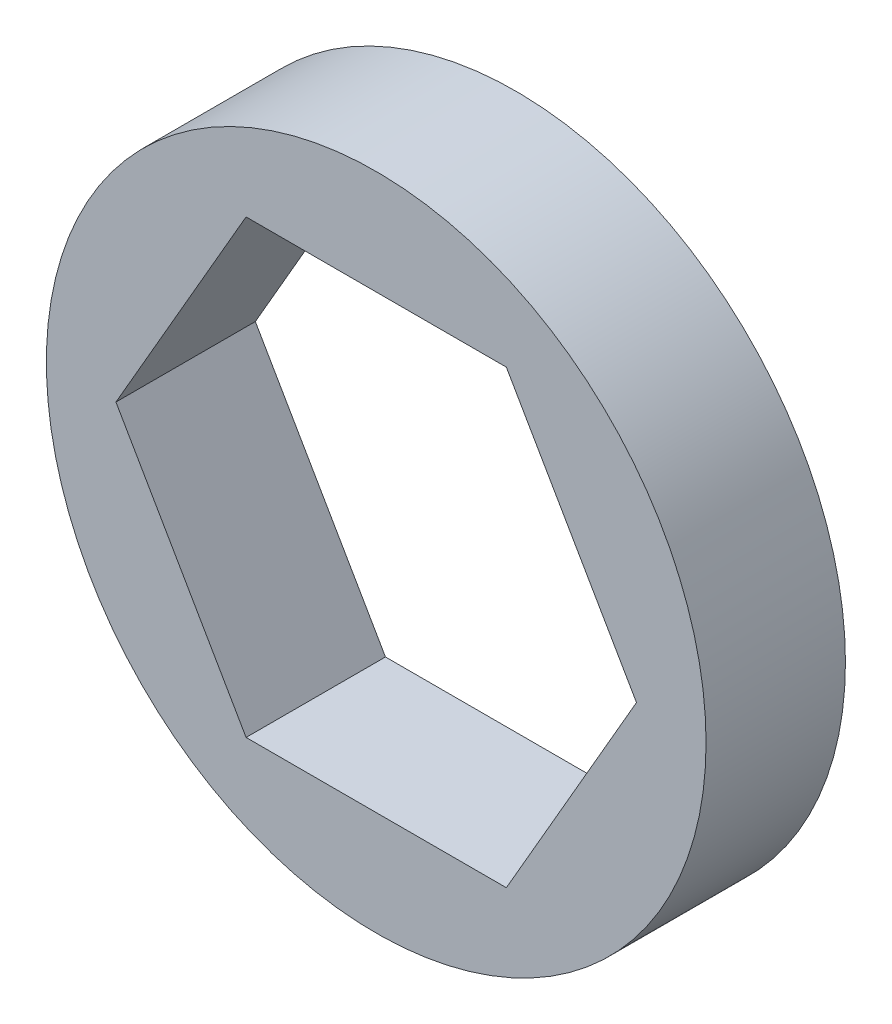
ISO-10303-21;
HEADER;
FILE_DESCRIPTION(('STEP AP214'),'2;1');
FILE_NAME('part.step','',(''),(''),'','','');
FILE_SCHEMA(('AUTOMOTIVE_DESIGN { 1 0 10303 214 1 1 1 1 }'));
ENDSEC;
DATA;
#1=APPLICATION_CONTEXT('core data for automotive mechanical design processes');
#2=APPLICATION_PROTOCOL_DEFINITION('international standard','automotive_design',2000,#1);
#3=PRODUCT_CONTEXT('',#1,'mechanical');
#4=PRODUCT('Part','Part','',(#3));
#5=PRODUCT_RELATED_PRODUCT_CATEGORY('part','',(#4));
#6=PRODUCT_DEFINITION_FORMATION('','',#4);
#7=PRODUCT_DEFINITION_CONTEXT('part definition',#1,'design');
#8=PRODUCT_DEFINITION('design','',#6,#7);
#9=PRODUCT_DEFINITION_SHAPE('','',#8);
#10=(LENGTH_UNIT() NAMED_UNIT(*) SI_UNIT(.MILLI.,.METRE.));
#11=(NAMED_UNIT(*) PLANE_ANGLE_UNIT() SI_UNIT($,.RADIAN.));
#12=(NAMED_UNIT(*) SI_UNIT($,.STERADIAN.) SOLID_ANGLE_UNIT());
#13=UNCERTAINTY_MEASURE_WITH_UNIT(LENGTH_MEASURE(1.E-05),#10,'distance_accuracy_value','');
#14=(GEOMETRIC_REPRESENTATION_CONTEXT(3) GLOBAL_UNCERTAINTY_ASSIGNED_CONTEXT((#13)) GLOBAL_UNIT_ASSIGNED_CONTEXT((#10,
#11,#12)) REPRESENTATION_CONTEXT('',''));
#15=CARTESIAN_POINT('',(0.,0.,0.));
#16=DIRECTION('',(0.,0.,1.));
#17=DIRECTION('',(1.,0.,0.));
#18=AXIS2_PLACEMENT_3D('',#15,#16,#17);
#19=CARTESIAN_POINT('',(0.,0.,4.025));
#20=DIRECTION('',(0.,0.,1.));
#21=DIRECTION('',(1.,0.,0.));
#22=AXIS2_PLACEMENT_3D('',#19,#20,#21);
#23=PLANE('',#22);
#24=CARTESIAN_POINT('',(0.,0.,4.025));
#25=DIRECTION('',(0.,0.,1.));
#26=DIRECTION('',(1.,0.,0.));
#27=AXIS2_PLACEMENT_3D('',#24,#25,#26);
#28=CIRCLE('',#27,9.525);
#29=CARTESIAN_POINT('',(9.525,0.,4.025));
#30=VERTEX_POINT('',#29);
#31=EDGE_CURVE('E11',#30,#30,#28,.T.);
#32=ORIENTED_EDGE('',*,*,#31,.T.);
#33=EDGE_LOOP('',(#32));
#34=FACE_BOUND('',#33,.T.);
#35=DIRECTION('',(-0.500000000000001,0.866025403784438,0.));
#36=VECTOR('',#35,1.);
#37=CARTESIAN_POINT('',(7.51565712917592,0.,4.025));
#38=LINE('',#37,#36);
#39=CARTESIAN_POINT('',(7.51565712917592,0.,4.025));
#40=VERTEX_POINT('',#39);
#41=CARTESIAN_POINT('',(3.75782856458794,6.50874999999997,4.025));
#42=VERTEX_POINT('',#41);
#43=EDGE_CURVE('E102',#40,#42,#38,.T.);
#44=ORIENTED_EDGE('',*,*,#43,.F.);
#45=DIRECTION('',(0.499999999999995,0.866025403784441,0.));
#46=VECTOR('',#45,1.);
#47=CARTESIAN_POINT('',(3.75782856458803,-6.50874999999992,4.025));
#48=LINE('',#47,#46);
#49=CARTESIAN_POINT('',(3.75782856458803,-6.50874999999992,4.025));
#50=VERTEX_POINT('',#49);
#51=EDGE_CURVE('E94',#50,#40,#48,.T.);
#52=ORIENTED_EDGE('',*,*,#51,.F.);
#53=DIRECTION('',(1.,0.,0.));
#54=VECTOR('',#53,1.);
#55=CARTESIAN_POINT('',(-3.7578285645879,-6.50875,4.025));
#56=LINE('',#55,#54);
#57=CARTESIAN_POINT('',(-3.7578285645879,-6.50875,4.025));
#58=VERTEX_POINT('',#57);
#59=EDGE_CURVE('E122',#58,#50,#56,.T.);
#60=ORIENTED_EDGE('',*,*,#59,.F.);
#61=DIRECTION('',(0.500000000000007,-0.866025403784435,0.));
#62=VECTOR('',#61,1.);
#63=CARTESIAN_POINT('',(-7.51565712917591,0.,4.025));
#64=LINE('',#63,#62);
#65=CARTESIAN_POINT('',(-7.51565712917591,0.,4.025));
#66=VERTEX_POINT('',#65);
#67=EDGE_CURVE('E120',#66,#58,#64,.T.);
#68=ORIENTED_EDGE('',*,*,#67,.F.);
#69=DIRECTION('',(-0.499999999999995,-0.866025403784442,0.));
#70=VECTOR('',#69,1.);
#71=CARTESIAN_POINT('',(-3.75782856458799,6.50874999999995,4.025));
#72=LINE('',#71,#70);
#73=CARTESIAN_POINT('',(-3.75782856458799,6.50874999999995,4.025));
#74=VERTEX_POINT('',#73);
#75=EDGE_CURVE('E116',#74,#66,#72,.T.);
#76=ORIENTED_EDGE('',*,*,#75,.F.);
#77=DIRECTION('',(-1.,0.,0.));
#78=VECTOR('',#77,1.);
#79=CARTESIAN_POINT('',(3.75782856458794,6.50874999999997,4.025));
#80=LINE('',#79,#78);
#81=EDGE_CURVE('E114',#42,#74,#80,.T.);
#82=ORIENTED_EDGE('',*,*,#81,.F.);
#83=EDGE_LOOP('',(#44,#52,#60,#68,#76,#82));
#84=FACE_BOUND('',#83,.T.);
#85=ADVANCED_FACE('F41',(#34,#84),#23,.T.);
#86=CARTESIAN_POINT('',(0.,0.,0.));
#87=DIRECTION('',(0.,0.,1.));
#88=DIRECTION('',(1.,0.,0.));
#89=AXIS2_PLACEMENT_3D('',#86,#87,#88);
#90=PLANE('',#89);
#91=CARTESIAN_POINT('',(0.,0.,0.));
#92=DIRECTION('',(0.,0.,1.));
#93=DIRECTION('',(1.,0.,0.));
#94=AXIS2_PLACEMENT_3D('',#91,#92,#93);
#95=CIRCLE('',#94,9.525);
#96=CARTESIAN_POINT('',(9.525,0.,0.));
#97=VERTEX_POINT('',#96);
#98=EDGE_CURVE('E45',#97,#97,#95,.T.);
#99=ORIENTED_EDGE('',*,*,#98,.F.);
#100=EDGE_LOOP('',(#99));
#101=FACE_BOUND('',#100,.T.);
#102=DIRECTION('',(0.499999999999995,0.866025403784441,0.));
#103=VECTOR('',#102,1.);
#104=CARTESIAN_POINT('',(3.75782856458803,-6.50874999999992,0.));
#105=LINE('',#104,#103);
#106=CARTESIAN_POINT('',(3.75782856458803,-6.50874999999992,0.));
#107=VERTEX_POINT('',#106);
#108=CARTESIAN_POINT('',(7.51565712917592,0.,0.));
#109=VERTEX_POINT('',#108);
#110=EDGE_CURVE('E64',#107,#109,#105,.T.);
#111=ORIENTED_EDGE('',*,*,#110,.T.);
#112=DIRECTION('',(-0.500000000000001,0.866025403784438,0.));
#113=VECTOR('',#112,1.);
#114=CARTESIAN_POINT('',(7.51565712917592,0.,0.));
#115=LINE('',#114,#113);
#116=CARTESIAN_POINT('',(3.75782856458794,6.50874999999997,0.));
#117=VERTEX_POINT('',#116);
#118=EDGE_CURVE('E109',#109,#117,#115,.T.);
#119=ORIENTED_EDGE('',*,*,#118,.T.);
#120=DIRECTION('',(-1.,0.,0.));
#121=VECTOR('',#120,1.);
#122=CARTESIAN_POINT('',(3.75782856458794,6.50874999999997,0.));
#123=LINE('',#122,#121);
#124=CARTESIAN_POINT('',(-3.75782856458799,6.50874999999995,0.));
#125=VERTEX_POINT('',#124);
#126=EDGE_CURVE('E126',#117,#125,#123,.T.);
#127=ORIENTED_EDGE('',*,*,#126,.T.);
#128=DIRECTION('',(-0.499999999999995,-0.866025403784442,0.));
#129=VECTOR('',#128,1.);
#130=CARTESIAN_POINT('',(-3.75782856458799,6.50874999999995,0.));
#131=LINE('',#130,#129);
#132=CARTESIAN_POINT('',(-7.51565712917591,0.,0.));
#133=VERTEX_POINT('',#132);
#134=EDGE_CURVE('E129',#125,#133,#131,.T.);
#135=ORIENTED_EDGE('',*,*,#134,.T.);
#136=DIRECTION('',(0.500000000000007,-0.866025403784435,0.));
#137=VECTOR('',#136,1.);
#138=CARTESIAN_POINT('',(-7.51565712917591,0.,0.));
#139=LINE('',#138,#137);
#140=CARTESIAN_POINT('',(-3.7578285645879,-6.50875,0.));
#141=VERTEX_POINT('',#140);
#142=EDGE_CURVE('E132',#133,#141,#139,.T.);
#143=ORIENTED_EDGE('',*,*,#142,.T.);
#144=DIRECTION('',(1.,0.,0.));
#145=VECTOR('',#144,1.);
#146=CARTESIAN_POINT('',(-3.7578285645879,-6.50875,0.));
#147=LINE('',#146,#145);
#148=EDGE_CURVE('E103',#141,#107,#147,.T.);
#149=ORIENTED_EDGE('',*,*,#148,.T.);
#150=EDGE_LOOP('',(#111,#119,#127,#135,#143,#149));
#151=FACE_BOUND('',#150,.T.);
#152=ADVANCED_FACE('F149',(#101,#151),#90,.F.);
#153=CARTESIAN_POINT('',(0.,0.,4.025));
#154=DIRECTION('',(0.,0.,-1.));
#155=DIRECTION('',(-1.,0.,0.));
#156=AXIS2_PLACEMENT_3D('',#153,#154,#155);
#157=CYLINDRICAL_SURFACE('',#156,9.525);
#158=ORIENTED_EDGE('',*,*,#31,.F.);
#159=EDGE_LOOP('',(#158));
#160=FACE_BOUND('',#159,.T.);
#161=ORIENTED_EDGE('',*,*,#98,.T.);
#162=EDGE_LOOP('',(#161));
#163=FACE_BOUND('',#162,.T.);
#164=ADVANCED_FACE('F43',(#160,#163),#157,.T.);
#165=CARTESIAN_POINT('',(3.75782856458803,-6.50874999999992,4.025));
#166=DIRECTION('',(-0.866025403784441,0.499999999999995,0.));
#167=DIRECTION('',(-0.499999999999995,-0.866025403784442,0.));
#168=AXIS2_PLACEMENT_3D('',#165,#166,#167);
#169=PLANE('',#168);
#170=ORIENTED_EDGE('',*,*,#110,.F.);
#171=DIRECTION('',(0.,0.,-1.));
#172=VECTOR('',#171,1.);
#173=CARTESIAN_POINT('',(3.75782856458803,-6.50874999999992,4.025));
#174=LINE('',#173,#172);
#175=EDGE_CURVE('E98',#50,#107,#174,.T.);
#176=ORIENTED_EDGE('',*,*,#175,.F.);
#177=ORIENTED_EDGE('',*,*,#51,.T.);
#178=DIRECTION('',(0.,0.,-1.));
#179=VECTOR('',#178,1.);
#180=CARTESIAN_POINT('',(7.51565712917592,0.,4.025));
#181=LINE('',#180,#179);
#182=EDGE_CURVE('E97',#40,#109,#181,.T.);
#183=ORIENTED_EDGE('',*,*,#182,.T.);
#184=EDGE_LOOP('',(#170,#176,#177,#183));
#185=FACE_BOUND('',#184,.T.);
#186=ADVANCED_FACE('F96',(#185),#169,.T.);
#187=CARTESIAN_POINT('',(7.51565712917592,0.,4.025));
#188=DIRECTION('',(-0.866025403784438,-0.500000000000001,0.));
#189=DIRECTION('',(0.500000000000001,-0.866025403784438,0.));
#190=AXIS2_PLACEMENT_3D('',#187,#188,#189);
#191=PLANE('',#190);
#192=ORIENTED_EDGE('',*,*,#118,.F.);
#193=ORIENTED_EDGE('',*,*,#182,.F.);
#194=ORIENTED_EDGE('',*,*,#43,.T.);
#195=DIRECTION('',(0.,0.,-1.));
#196=VECTOR('',#195,1.);
#197=CARTESIAN_POINT('',(3.75782856458794,6.50874999999997,4.025));
#198=LINE('',#197,#196);
#199=EDGE_CURVE('E110',#42,#117,#198,.T.);
#200=ORIENTED_EDGE('',*,*,#199,.T.);
#201=EDGE_LOOP('',(#192,#193,#194,#200));
#202=FACE_BOUND('',#201,.T.);
#203=ADVANCED_FACE('F106',(#202),#191,.T.);
#204=CARTESIAN_POINT('',(3.75782856458794,6.50874999999997,4.025));
#205=DIRECTION('',(0.,-1.,0.));
#206=DIRECTION('',(1.,0.,0.));
#207=AXIS2_PLACEMENT_3D('',#204,#205,#206);
#208=PLANE('',#207);
#209=ORIENTED_EDGE('',*,*,#126,.F.);
#210=ORIENTED_EDGE('',*,*,#199,.F.);
#211=ORIENTED_EDGE('',*,*,#81,.T.);
#212=DIRECTION('',(0.,0.,-1.));
#213=VECTOR('',#212,1.);
#214=CARTESIAN_POINT('',(-3.75782856458799,6.50874999999995,4.025));
#215=LINE('',#214,#213);
#216=EDGE_CURVE('E141',#74,#125,#215,.T.);
#217=ORIENTED_EDGE('',*,*,#216,.T.);
#218=EDGE_LOOP('',(#209,#210,#211,#217));
#219=FACE_BOUND('',#218,.T.);
#220=ADVANCED_FACE('F145',(#219),#208,.T.);
#221=CARTESIAN_POINT('',(-3.75782856458799,6.50874999999995,4.025));
#222=DIRECTION('',(0.866025403784441,-0.499999999999995,0.));
#223=DIRECTION('',(0.499999999999995,0.866025403784442,0.));
#224=AXIS2_PLACEMENT_3D('',#221,#222,#223);
#225=PLANE('',#224);
#226=ORIENTED_EDGE('',*,*,#134,.F.);
#227=ORIENTED_EDGE('',*,*,#216,.F.);
#228=ORIENTED_EDGE('',*,*,#75,.T.);
#229=DIRECTION('',(0.,0.,-1.));
#230=VECTOR('',#229,1.);
#231=CARTESIAN_POINT('',(-7.51565712917591,0.,4.025));
#232=LINE('',#231,#230);
#233=EDGE_CURVE('E139',#66,#133,#232,.T.);
#234=ORIENTED_EDGE('',*,*,#233,.T.);
#235=EDGE_LOOP('',(#226,#227,#228,#234));
#236=FACE_BOUND('',#235,.T.);
#237=ADVANCED_FACE('F157',(#236),#225,.T.);
#238=CARTESIAN_POINT('',(-7.51565712917591,0.,4.025));
#239=DIRECTION('',(0.866025403784434,0.500000000000007,0.));
#240=DIRECTION('',(-0.500000000000007,0.866025403784435,0.));
#241=AXIS2_PLACEMENT_3D('',#238,#239,#240);
#242=PLANE('',#241);
#243=ORIENTED_EDGE('',*,*,#142,.F.);
#244=ORIENTED_EDGE('',*,*,#233,.F.);
#245=ORIENTED_EDGE('',*,*,#67,.T.);
#246=DIRECTION('',(0.,0.,-1.));
#247=VECTOR('',#246,1.);
#248=CARTESIAN_POINT('',(-3.7578285645879,-6.50875,4.025));
#249=LINE('',#248,#247);
#250=EDGE_CURVE('E56',#58,#141,#249,.T.);
#251=ORIENTED_EDGE('',*,*,#250,.T.);
#252=EDGE_LOOP('',(#243,#244,#245,#251));
#253=FACE_BOUND('',#252,.T.);
#254=ADVANCED_FACE('F155',(#253),#242,.T.);
#255=CARTESIAN_POINT('',(-3.7578285645879,-6.50875,4.025));
#256=DIRECTION('',(0.,1.,0.));
#257=DIRECTION('',(-1.,0.,0.));
#258=AXIS2_PLACEMENT_3D('',#255,#256,#257);
#259=PLANE('',#258);
#260=ORIENTED_EDGE('',*,*,#148,.F.);
#261=ORIENTED_EDGE('',*,*,#250,.F.);
#262=ORIENTED_EDGE('',*,*,#59,.T.);
#263=ORIENTED_EDGE('',*,*,#175,.T.);
#264=EDGE_LOOP('',(#260,#261,#262,#263));
#265=FACE_BOUND('',#264,.T.);
#266=ADVANCED_FACE('F151',(#265),#259,.T.);
#267=CLOSED_SHELL('',(#85,#152,#164,#186,#203,#220,#237,#254,#266));
#268=MANIFOLD_SOLID_BREP('B2',#267);
#269=ADVANCED_BREP_SHAPE_REPRESENTATION('',(#18,#268),#14);
#270=SHAPE_DEFINITION_REPRESENTATION(#9,#269);
ENDSEC;
END-ISO-10303-21;
